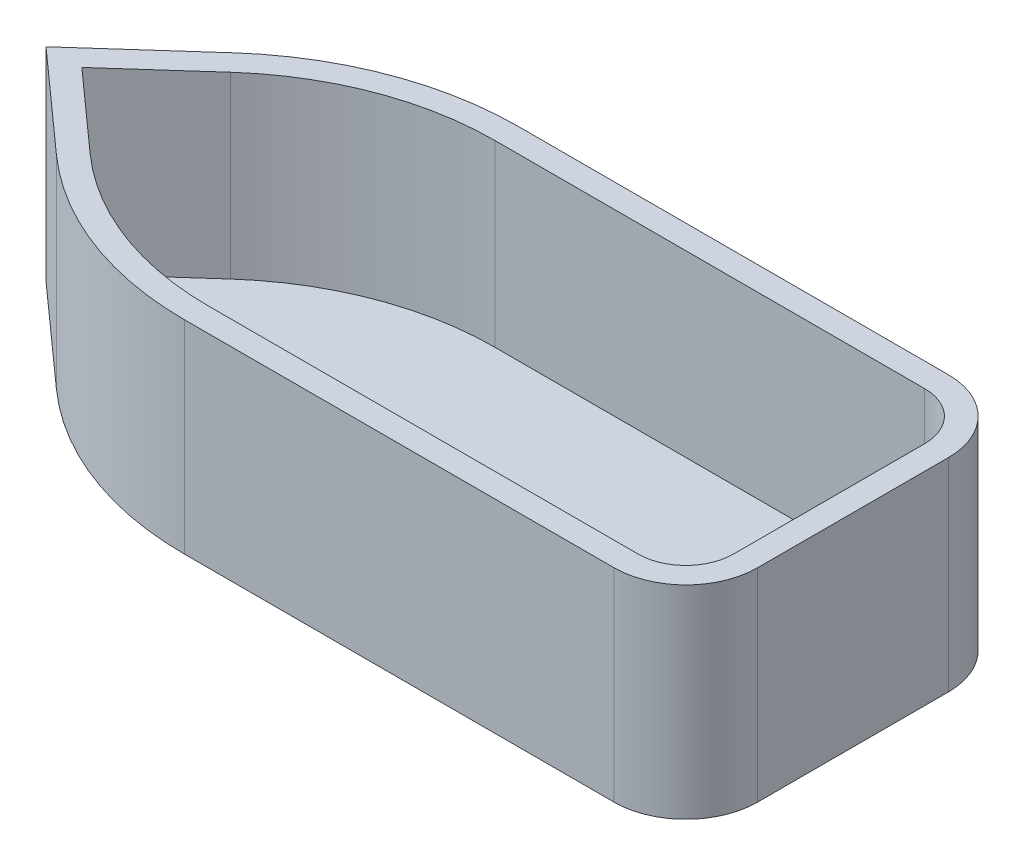
ISO-10303-21;
HEADER;
FILE_DESCRIPTION(('STEP AP214'),'2;1');
FILE_NAME('part.step','',(''),(''),'','','');
FILE_SCHEMA(('AUTOMOTIVE_DESIGN { 1 0 10303 214 1 1 1 1 }'));
ENDSEC;
DATA;
#1=APPLICATION_CONTEXT('core data for automotive mechanical design processes');
#2=APPLICATION_PROTOCOL_DEFINITION('international standard','automotive_design',2000,#1);
#3=PRODUCT_CONTEXT('',#1,'mechanical');
#4=PRODUCT('Part','Part','',(#3));
#5=PRODUCT_RELATED_PRODUCT_CATEGORY('part','',(#4));
#6=PRODUCT_DEFINITION_FORMATION('','',#4);
#7=PRODUCT_DEFINITION_CONTEXT('part definition',#1,'design');
#8=PRODUCT_DEFINITION('design','',#6,#7);
#9=PRODUCT_DEFINITION_SHAPE('','',#8);
#10=(LENGTH_UNIT() NAMED_UNIT(*) SI_UNIT(.MILLI.,.METRE.));
#11=(NAMED_UNIT(*) PLANE_ANGLE_UNIT() SI_UNIT($,.RADIAN.));
#12=(NAMED_UNIT(*) SI_UNIT($,.STERADIAN.) SOLID_ANGLE_UNIT());
#13=UNCERTAINTY_MEASURE_WITH_UNIT(LENGTH_MEASURE(1.E-05),#10,'distance_accuracy_value','');
#14=(GEOMETRIC_REPRESENTATION_CONTEXT(3) GLOBAL_UNCERTAINTY_ASSIGNED_CONTEXT((#13)) GLOBAL_UNIT_ASSIGNED_CONTEXT((#10,
#11,#12)) REPRESENTATION_CONTEXT('',''));
#15=CARTESIAN_POINT('',(0.,0.,0.));
#16=DIRECTION('',(0.,0.,1.));
#17=DIRECTION('',(1.,0.,0.));
#18=AXIS2_PLACEMENT_3D('',#15,#16,#17);
#19=CARTESIAN_POINT('',(-57.8038067349927,75.,-40.));
#20=DIRECTION('',(0.,-1.,0.));
#21=DIRECTION('',(0.,0.,-1.));
#22=AXIS2_PLACEMENT_3D('',#19,#20,#21);
#23=PLANE('',#22);
#24=CARTESIAN_POINT('',(-57.8038067349927,75.,-40.));
#25=DIRECTION('',(0.,-1.,0.));
#26=DIRECTION('',(0.,0.,-1.));
#27=AXIS2_PLACEMENT_3D('',#24,#25,#26);
#28=CIRCLE('',#27,30.);
#29=CARTESIAN_POINT('',(-27.8038067349927,75.,-40.));
#30=VERTEX_POINT('',#29);
#31=CARTESIAN_POINT('',(-57.8038067349927,75.,-70.));
#32=VERTEX_POINT('',#31);
#33=EDGE_CURVE('E333',#30,#32,#28,.F.);
#34=ORIENTED_EDGE('',*,*,#33,.T.);
#35=DIRECTION('',(-1.,0.,0.));
#36=VECTOR('',#35,1.);
#37=CARTESIAN_POINT('',(-57.8038067349927,75.,-70.));
#38=LINE('',#37,#36);
#39=CARTESIAN_POINT('',(-237.803806734993,75.,-70.));
#40=VERTEX_POINT('',#39);
#41=EDGE_CURVE('E336',#32,#40,#38,.T.);
#42=ORIENTED_EDGE('',*,*,#41,.T.);
#43=CARTESIAN_POINT('',(-237.803806734993,75.,60.));
#44=DIRECTION('',(0.,-1.,0.));
#45=DIRECTION('',(0.,0.,-1.));
#46=AXIS2_PLACEMENT_3D('',#43,#44,#45);
#47=CIRCLE('',#46,130.);
#48=CARTESIAN_POINT('',(-324.470473401659,75.,-36.8962790249908));
#49=VERTEX_POINT('',#48);
#50=EDGE_CURVE('E339',#40,#49,#47,.F.);
#51=ORIENTED_EDGE('',*,*,#50,.T.);
#52=DIRECTION('',(-0.745355992499929,0.,0.666666666666668));
#53=VECTOR('',#52,1.);
#54=CARTESIAN_POINT('',(-174.780073901664,75.,-170.783442569427));
#55=LINE('',#54,#53);
#56=CARTESIAN_POINT('',(-365.721767409999,75.,0.));
#57=VERTEX_POINT('',#56);
#58=EDGE_CURVE('E342',#49,#57,#55,.T.);
#59=ORIENTED_EDGE('',*,*,#58,.T.);
#60=DIRECTION('',(0.745355992499929,0.,0.666666666666667));
#61=VECTOR('',#60,1.);
#62=CARTESIAN_POINT('',(-214.53239350166,75.,135.227887013871));
#63=LINE('',#62,#61);
#64=CARTESIAN_POINT('',(-324.470473401659,75.,36.8962790249909));
#65=VERTEX_POINT('',#64);
#66=EDGE_CURVE('E345',#57,#65,#63,.T.);
#67=ORIENTED_EDGE('',*,*,#66,.T.);
#68=CARTESIAN_POINT('',(-237.803806734993,75.,-60.));
#69=DIRECTION('',(0.,-1.,0.));
#70=DIRECTION('',(0.,0.,-1.));
#71=AXIS2_PLACEMENT_3D('',#68,#69,#70);
#72=CIRCLE('',#71,130.);
#73=CARTESIAN_POINT('',(-237.803806734993,75.,70.));
#74=VERTEX_POINT('',#73);
#75=EDGE_CURVE('E348',#65,#74,#72,.F.);
#76=ORIENTED_EDGE('',*,*,#75,.T.);
#77=DIRECTION('',(1.,0.,0.));
#78=VECTOR('',#77,1.);
#79=CARTESIAN_POINT('',(-57.8038067349926,75.,70.));
#80=LINE('',#79,#78);
#81=CARTESIAN_POINT('',(-57.8038067349927,75.,70.));
#82=VERTEX_POINT('',#81);
#83=EDGE_CURVE('E351',#74,#82,#80,.T.);
#84=ORIENTED_EDGE('',*,*,#83,.T.);
#85=CARTESIAN_POINT('',(-57.8038067349927,75.,40.));
#86=DIRECTION('',(0.,-1.,0.));
#87=DIRECTION('',(0.,0.,-1.));
#88=AXIS2_PLACEMENT_3D('',#85,#86,#87);
#89=CIRCLE('',#88,30.);
#90=CARTESIAN_POINT('',(-27.8038067349927,75.,40.));
#91=VERTEX_POINT('',#90);
#92=EDGE_CURVE('E353',#82,#91,#89,.F.);
#93=ORIENTED_EDGE('',*,*,#92,.T.);
#94=DIRECTION('',(0.,0.,-1.));
#95=VECTOR('',#94,1.);
#96=CARTESIAN_POINT('',(-27.8038067349927,75.,-40.));
#97=LINE('',#96,#95);
#98=EDGE_CURVE('E48',#91,#30,#97,.T.);
#99=ORIENTED_EDGE('',*,*,#98,.T.);
#100=EDGE_LOOP('',(#34,#42,#51,#59,#67,#76,#84,#93,#99));
#101=FACE_BOUND('',#100,.T.);
#102=CARTESIAN_POINT('',(-57.8038067349927,75.,-40.));
#103=DIRECTION('',(0.,1.,0.));
#104=DIRECTION('',(0.,0.,-1.));
#105=AXIS2_PLACEMENT_3D('',#102,#103,#104);
#106=CIRCLE('',#105,20.);
#107=CARTESIAN_POINT('',(-37.8038067349927,75.,-40.));
#108=VERTEX_POINT('',#107);
#109=CARTESIAN_POINT('',(-57.8038067349927,75.,-60.));
#110=VERTEX_POINT('',#109);
#111=EDGE_CURVE('E174',#108,#110,#106,.T.);
#112=ORIENTED_EDGE('',*,*,#111,.F.);
#113=DIRECTION('',(0.,0.,-1.));
#114=VECTOR('',#113,1.);
#115=CARTESIAN_POINT('',(-37.8038067349927,75.,40.));
#116=LINE('',#115,#114);
#117=CARTESIAN_POINT('',(-37.8038067349927,75.,40.));
#118=VERTEX_POINT('',#117);
#119=EDGE_CURVE('E221',#118,#108,#116,.T.);
#120=ORIENTED_EDGE('',*,*,#119,.F.);
#121=CARTESIAN_POINT('',(-57.8038067349927,75.,40.));
#122=DIRECTION('',(0.,1.,0.));
#123=DIRECTION('',(0.,0.,1.));
#124=AXIS2_PLACEMENT_3D('',#121,#122,#123);
#125=CIRCLE('',#124,20.);
#126=CARTESIAN_POINT('',(-57.8038067349927,75.,60.));
#127=VERTEX_POINT('',#126);
#128=EDGE_CURVE('E218',#127,#118,#125,.T.);
#129=ORIENTED_EDGE('',*,*,#128,.F.);
#130=DIRECTION('',(1.,0.,0.));
#131=VECTOR('',#130,1.);
#132=CARTESIAN_POINT('',(-237.803806734993,75.,60.));
#133=LINE('',#132,#131);
#134=CARTESIAN_POINT('',(-237.803806734993,75.,60.));
#135=VERTEX_POINT('',#134);
#136=EDGE_CURVE('E215',#135,#127,#133,.T.);
#137=ORIENTED_EDGE('',*,*,#136,.F.);
#138=CARTESIAN_POINT('',(-237.803806734993,75.,-60.));
#139=DIRECTION('',(0.,1.,0.));
#140=DIRECTION('',(0.,0.,-1.));
#141=AXIS2_PLACEMENT_3D('',#138,#139,#140);
#142=CIRCLE('',#141,120.);
#143=CARTESIAN_POINT('',(-317.803806734993,75.,29.4427190999916));
#144=VERTEX_POINT('',#143);
#145=EDGE_CURVE('E212',#144,#135,#142,.T.);
#146=ORIENTED_EDGE('',*,*,#145,.F.);
#147=DIRECTION('',(0.745355992499929,0.,0.666666666666667));
#148=VECTOR('',#147,1.);
#149=CARTESIAN_POINT('',(-317.803806734993,75.,29.4427190999916));
#150=LINE('',#149,#148);
#151=CARTESIAN_POINT('',(-350.721767409999,75.,0.));
#152=VERTEX_POINT('',#151);
#153=EDGE_CURVE('E209',#152,#144,#150,.T.);
#154=ORIENTED_EDGE('',*,*,#153,.F.);
#155=DIRECTION('',(-0.745355992499929,0.,0.666666666666668));
#156=VECTOR('',#155,1.);
#157=CARTESIAN_POINT('',(-317.803806734993,75.,-29.4427190999916));
#158=LINE('',#157,#156);
#159=CARTESIAN_POINT('',(-317.803806734993,75.,-29.4427190999916));
#160=VERTEX_POINT('',#159);
#161=EDGE_CURVE('E204',#160,#152,#158,.T.);
#162=ORIENTED_EDGE('',*,*,#161,.F.);
#163=CARTESIAN_POINT('',(-237.803806734993,75.,60.));
#164=DIRECTION('',(0.,1.,0.));
#165=DIRECTION('',(0.,0.,-1.));
#166=AXIS2_PLACEMENT_3D('',#163,#164,#165);
#167=CIRCLE('',#166,120.);
#168=CARTESIAN_POINT('',(-237.803806734993,75.,-60.));
#169=VERTEX_POINT('',#168);
#170=EDGE_CURVE('E200',#169,#160,#167,.T.);
#171=ORIENTED_EDGE('',*,*,#170,.F.);
#172=DIRECTION('',(-1.,0.,0.));
#173=VECTOR('',#172,1.);
#174=CARTESIAN_POINT('',(-237.803806734993,75.,-60.));
#175=LINE('',#174,#173);
#176=EDGE_CURVE('E186',#110,#169,#175,.T.);
#177=ORIENTED_EDGE('',*,*,#176,.F.);
#178=EDGE_LOOP('',(#112,#120,#129,#137,#146,#154,#162,#171,#177));
#179=FACE_BOUND('',#178,.T.);
#180=ADVANCED_FACE('F44',(#101,#179),#23,.F.);
#181=CARTESIAN_POINT('',(-57.8038067349927,75.,-40.));
#182=DIRECTION('',(0.,-1.,0.));
#183=DIRECTION('',(0.,0.,-1.));
#184=AXIS2_PLACEMENT_3D('',#181,#182,#183);
#185=CYLINDRICAL_SURFACE('',#184,30.);
#186=CARTESIAN_POINT('',(-57.8038067349927,-9.99999999999999,-40.));
#187=DIRECTION('',(0.,-1.,0.));
#188=DIRECTION('',(0.,0.,-1.));
#189=AXIS2_PLACEMENT_3D('',#186,#187,#188);
#190=CIRCLE('',#189,30.);
#191=CARTESIAN_POINT('',(-27.8038067349927,-9.99999999999999,-40.));
#192=VERTEX_POINT('',#191);
#193=CARTESIAN_POINT('',(-57.8038067349927,-9.99999999999999,-70.));
#194=VERTEX_POINT('',#193);
#195=EDGE_CURVE('E195',#192,#194,#190,.F.);
#196=ORIENTED_EDGE('',*,*,#195,.T.);
#197=DIRECTION('',(0.,1.,0.));
#198=VECTOR('',#197,1.);
#199=CARTESIAN_POINT('',(-57.8038067349927,75.,-70.));
#200=LINE('',#199,#198);
#201=EDGE_CURVE('E11',#32,#194,#200,.F.);
#202=ORIENTED_EDGE('',*,*,#201,.F.);
#203=ORIENTED_EDGE('',*,*,#33,.F.);
#204=DIRECTION('',(0.,-1.,0.));
#205=VECTOR('',#204,1.);
#206=CARTESIAN_POINT('',(-27.8038067349927,75.,-40.));
#207=LINE('',#206,#205);
#208=EDGE_CURVE('E279',#30,#192,#207,.T.);
#209=ORIENTED_EDGE('',*,*,#208,.T.);
#210=EDGE_LOOP('',(#196,#202,#203,#209));
#211=FACE_BOUND('',#210,.T.);
#212=ADVANCED_FACE('F370',(#211),#185,.T.);
#213=CARTESIAN_POINT('',(-237.803806734993,75.,-70.));
#214=DIRECTION('',(0.,0.,1.));
#215=DIRECTION('',(1.,0.,0.));
#216=AXIS2_PLACEMENT_3D('',#213,#214,#215);
#217=PLANE('',#216);
#218=DIRECTION('',(-1.,0.,0.));
#219=VECTOR('',#218,1.);
#220=CARTESIAN_POINT('',(-57.8038067349927,-10.,-70.));
#221=LINE('',#220,#219);
#222=CARTESIAN_POINT('',(-237.803806734993,-9.99999999999999,-70.));
#223=VERTEX_POINT('',#222);
#224=EDGE_CURVE('E277',#194,#223,#221,.T.);
#225=ORIENTED_EDGE('',*,*,#224,.T.);
#226=DIRECTION('',(0.,-1.,0.));
#227=VECTOR('',#226,1.);
#228=CARTESIAN_POINT('',(-237.803806734993,75.,-70.));
#229=LINE('',#228,#227);
#230=EDGE_CURVE('E54',#40,#223,#229,.T.);
#231=ORIENTED_EDGE('',*,*,#230,.F.);
#232=ORIENTED_EDGE('',*,*,#41,.F.);
#233=ORIENTED_EDGE('',*,*,#201,.T.);
#234=EDGE_LOOP('',(#225,#231,#232,#233));
#235=FACE_BOUND('',#234,.T.);
#236=ADVANCED_FACE('F375',(#235),#217,.F.);
#237=CARTESIAN_POINT('',(-237.803806734993,75.,60.));
#238=DIRECTION('',(0.,-1.,0.));
#239=DIRECTION('',(0.,0.,-1.));
#240=AXIS2_PLACEMENT_3D('',#237,#238,#239);
#241=CYLINDRICAL_SURFACE('',#240,130.);
#242=CARTESIAN_POINT('',(-237.803806734993,-9.99999999999999,60.));
#243=DIRECTION('',(0.,-1.,0.));
#244=DIRECTION('',(0.,0.,-1.));
#245=AXIS2_PLACEMENT_3D('',#242,#243,#244);
#246=CIRCLE('',#245,130.);
#247=CARTESIAN_POINT('',(-324.470473401659,-9.99999999999999,-36.8962790249909));
#248=VERTEX_POINT('',#247);
#249=EDGE_CURVE('E286',#223,#248,#246,.F.);
#250=ORIENTED_EDGE('',*,*,#249,.T.);
#251=DIRECTION('',(0.,1.,0.));
#252=VECTOR('',#251,1.);
#253=CARTESIAN_POINT('',(-324.470473401659,75.,-36.8962790249909));
#254=LINE('',#253,#252);
#255=EDGE_CURVE('E290',#49,#248,#254,.F.);
#256=ORIENTED_EDGE('',*,*,#255,.F.);
#257=ORIENTED_EDGE('',*,*,#50,.F.);
#258=ORIENTED_EDGE('',*,*,#230,.T.);
#259=EDGE_LOOP('',(#250,#256,#257,#258));
#260=FACE_BOUND('',#259,.T.);
#261=ADVANCED_FACE('F378',(#260),#241,.T.);
#262=CARTESIAN_POINT('',(-324.470473401659,75.,-36.8962790249909));
#263=DIRECTION('',(0.666666666666668,0.,0.745355992499929));
#264=DIRECTION('',(0.745355992499929,0.,-0.666666666666668));
#265=AXIS2_PLACEMENT_3D('',#262,#263,#264);
#266=PLANE('',#265);
#267=DIRECTION('',(-0.745355992499929,0.,0.666666666666668));
#268=VECTOR('',#267,1.);
#269=CARTESIAN_POINT('',(-174.780073901664,-10.,-170.783442569427));
#270=LINE('',#269,#268);
#271=CARTESIAN_POINT('',(-365.721767409999,-10.,0.));
#272=VERTEX_POINT('',#271);
#273=EDGE_CURVE('E293',#248,#272,#270,.T.);
#274=ORIENTED_EDGE('',*,*,#273,.T.);
#275=DIRECTION('',(0.,-1.,0.));
#276=VECTOR('',#275,1.);
#277=CARTESIAN_POINT('',(-365.721767409999,75.,0.));
#278=LINE('',#277,#276);
#279=EDGE_CURVE('E297',#57,#272,#278,.T.);
#280=ORIENTED_EDGE('',*,*,#279,.F.);
#281=ORIENTED_EDGE('',*,*,#58,.F.);
#282=ORIENTED_EDGE('',*,*,#255,.T.);
#283=EDGE_LOOP('',(#274,#280,#281,#282));
#284=FACE_BOUND('',#283,.T.);
#285=ADVANCED_FACE('F383',(#284),#266,.F.);
#286=CARTESIAN_POINT('',(-324.470473401659,75.,36.8962790249909));
#287=DIRECTION('',(0.666666666666667,0.,-0.745355992499929));
#288=DIRECTION('',(-0.745355992499929,0.,-0.666666666666667));
#289=AXIS2_PLACEMENT_3D('',#286,#287,#288);
#290=PLANE('',#289);
#291=DIRECTION('',(0.745355992499929,0.,0.666666666666667));
#292=VECTOR('',#291,1.);
#293=CARTESIAN_POINT('',(-214.53239350166,-10.,135.227887013871));
#294=LINE('',#293,#292);
#295=CARTESIAN_POINT('',(-324.470473401659,-9.99999999999999,36.8962790249909));
#296=VERTEX_POINT('',#295);
#297=EDGE_CURVE('E300',#272,#296,#294,.T.);
#298=ORIENTED_EDGE('',*,*,#297,.T.);
#299=DIRECTION('',(0.,-1.,0.));
#300=VECTOR('',#299,1.);
#301=CARTESIAN_POINT('',(-324.470473401659,75.,36.8962790249909));
#302=LINE('',#301,#300);
#303=EDGE_CURVE('E304',#65,#296,#302,.T.);
#304=ORIENTED_EDGE('',*,*,#303,.F.);
#305=ORIENTED_EDGE('',*,*,#66,.F.);
#306=ORIENTED_EDGE('',*,*,#279,.T.);
#307=EDGE_LOOP('',(#298,#304,#305,#306));
#308=FACE_BOUND('',#307,.T.);
#309=ADVANCED_FACE('F389',(#308),#290,.F.);
#310=CARTESIAN_POINT('',(-237.803806734993,75.,-60.));
#311=DIRECTION('',(0.,-1.,0.));
#312=DIRECTION('',(0.,0.,-1.));
#313=AXIS2_PLACEMENT_3D('',#310,#311,#312);
#314=CYLINDRICAL_SURFACE('',#313,130.);
#315=CARTESIAN_POINT('',(-237.803806734993,-9.99999999999999,-60.));
#316=DIRECTION('',(0.,-1.,0.));
#317=DIRECTION('',(0.,0.,-1.));
#318=AXIS2_PLACEMENT_3D('',#315,#316,#317);
#319=CIRCLE('',#318,130.);
#320=CARTESIAN_POINT('',(-237.803806734993,-9.99999999999999,70.));
#321=VERTEX_POINT('',#320);
#322=EDGE_CURVE('E307',#296,#321,#319,.F.);
#323=ORIENTED_EDGE('',*,*,#322,.T.);
#324=DIRECTION('',(0.,1.,0.));
#325=VECTOR('',#324,1.);
#326=CARTESIAN_POINT('',(-237.803806734993,75.,70.));
#327=LINE('',#326,#325);
#328=EDGE_CURVE('E311',#74,#321,#327,.F.);
#329=ORIENTED_EDGE('',*,*,#328,.F.);
#330=ORIENTED_EDGE('',*,*,#75,.F.);
#331=ORIENTED_EDGE('',*,*,#303,.T.);
#332=EDGE_LOOP('',(#323,#329,#330,#331));
#333=FACE_BOUND('',#332,.T.);
#334=ADVANCED_FACE('F393',(#333),#314,.T.);
#335=CARTESIAN_POINT('',(-237.803806734993,75.,70.));
#336=DIRECTION('',(0.,0.,-1.));
#337=DIRECTION('',(-1.,0.,0.));
#338=AXIS2_PLACEMENT_3D('',#335,#336,#337);
#339=PLANE('',#338);
#340=DIRECTION('',(1.,0.,0.));
#341=VECTOR('',#340,1.);
#342=CARTESIAN_POINT('',(-57.8038067349926,-10.,70.));
#343=LINE('',#342,#341);
#344=CARTESIAN_POINT('',(-57.8038067349927,-9.99999999999999,70.));
#345=VERTEX_POINT('',#344);
#346=EDGE_CURVE('E314',#321,#345,#343,.T.);
#347=ORIENTED_EDGE('',*,*,#346,.T.);
#348=DIRECTION('',(0.,-1.,0.));
#349=VECTOR('',#348,1.);
#350=CARTESIAN_POINT('',(-57.8038067349927,75.,70.));
#351=LINE('',#350,#349);
#352=EDGE_CURVE('E318',#82,#345,#351,.T.);
#353=ORIENTED_EDGE('',*,*,#352,.F.);
#354=ORIENTED_EDGE('',*,*,#83,.F.);
#355=ORIENTED_EDGE('',*,*,#328,.T.);
#356=EDGE_LOOP('',(#347,#353,#354,#355));
#357=FACE_BOUND('',#356,.T.);
#358=ADVANCED_FACE('F396',(#357),#339,.F.);
#359=CARTESIAN_POINT('',(-57.8038067349927,75.,40.));
#360=DIRECTION('',(0.,-1.,0.));
#361=DIRECTION('',(0.,0.,-1.));
#362=AXIS2_PLACEMENT_3D('',#359,#360,#361);
#363=CYLINDRICAL_SURFACE('',#362,30.);
#364=CARTESIAN_POINT('',(-57.8038067349927,-9.99999999999999,40.));
#365=DIRECTION('',(0.,-1.,0.));
#366=DIRECTION('',(0.,0.,-1.));
#367=AXIS2_PLACEMENT_3D('',#364,#365,#366);
#368=CIRCLE('',#367,30.);
#369=CARTESIAN_POINT('',(-27.8038067349927,-9.99999999999999,40.));
#370=VERTEX_POINT('',#369);
#371=EDGE_CURVE('E321',#345,#370,#368,.F.);
#372=ORIENTED_EDGE('',*,*,#371,.T.);
#373=DIRECTION('',(0.,1.,0.));
#374=VECTOR('',#373,1.);
#375=CARTESIAN_POINT('',(-27.8038067349927,75.,40.));
#376=LINE('',#375,#374);
#377=EDGE_CURVE('E283',#91,#370,#376,.F.);
#378=ORIENTED_EDGE('',*,*,#377,.F.);
#379=ORIENTED_EDGE('',*,*,#92,.F.);
#380=ORIENTED_EDGE('',*,*,#352,.T.);
#381=EDGE_LOOP('',(#372,#378,#379,#380));
#382=FACE_BOUND('',#381,.T.);
#383=ADVANCED_FACE('F361',(#382),#363,.T.);
#384=CARTESIAN_POINT('',(-27.8038067349927,75.,40.));
#385=DIRECTION('',(-1.,0.,0.));
#386=DIRECTION('',(0.,0.,1.));
#387=AXIS2_PLACEMENT_3D('',#384,#385,#386);
#388=PLANE('',#387);
#389=DIRECTION('',(0.,0.,-1.));
#390=VECTOR('',#389,1.);
#391=CARTESIAN_POINT('',(-27.8038067349927,-10.,-40.));
#392=LINE('',#391,#390);
#393=EDGE_CURVE('E327',#370,#192,#392,.T.);
#394=ORIENTED_EDGE('',*,*,#393,.T.);
#395=ORIENTED_EDGE('',*,*,#208,.F.);
#396=ORIENTED_EDGE('',*,*,#98,.F.);
#397=ORIENTED_EDGE('',*,*,#377,.T.);
#398=EDGE_LOOP('',(#394,#395,#396,#397));
#399=FACE_BOUND('',#398,.T.);
#400=ADVANCED_FACE('F365',(#399),#388,.F.);
#401=CARTESIAN_POINT('',(-57.8038067349927,-10.,-40.));
#402=DIRECTION('',(0.,-1.,0.));
#403=DIRECTION('',(0.,0.,-1.));
#404=AXIS2_PLACEMENT_3D('',#401,#402,#403);
#405=PLANE('',#404);
#406=ORIENTED_EDGE('',*,*,#195,.F.);
#407=ORIENTED_EDGE('',*,*,#393,.F.);
#408=ORIENTED_EDGE('',*,*,#371,.F.);
#409=ORIENTED_EDGE('',*,*,#346,.F.);
#410=ORIENTED_EDGE('',*,*,#322,.F.);
#411=ORIENTED_EDGE('',*,*,#297,.F.);
#412=ORIENTED_EDGE('',*,*,#273,.F.);
#413=ORIENTED_EDGE('',*,*,#249,.F.);
#414=ORIENTED_EDGE('',*,*,#224,.F.);
#415=EDGE_LOOP('',(#406,#407,#408,#409,#410,#411,#412,#413,#414));
#416=FACE_BOUND('',#415,.T.);
#417=ADVANCED_FACE('F46',(#416),#405,.T.);
#418=CARTESIAN_POINT('',(-57.8038067349927,75.,-40.));
#419=DIRECTION('',(0.,-1.,0.));
#420=DIRECTION('',(0.,0.,-1.));
#421=AXIS2_PLACEMENT_3D('',#418,#419,#420);
#422=CYLINDRICAL_SURFACE('',#421,20.);
#423=CARTESIAN_POINT('',(-57.8038067349927,0.,-40.));
#424=DIRECTION('',(0.,1.,0.));
#425=DIRECTION('',(0.,0.,-1.));
#426=AXIS2_PLACEMENT_3D('',#423,#424,#425);
#427=CIRCLE('',#426,20.);
#428=CARTESIAN_POINT('',(-37.8038067349927,0.,-40.));
#429=VERTEX_POINT('',#428);
#430=CARTESIAN_POINT('',(-57.8038067349927,0.,-60.));
#431=VERTEX_POINT('',#430);
#432=EDGE_CURVE('E224',#429,#431,#427,.T.);
#433=ORIENTED_EDGE('',*,*,#432,.F.);
#434=DIRECTION('',(0.,-1.,0.));
#435=VECTOR('',#434,1.);
#436=CARTESIAN_POINT('',(-37.8038067349927,75.,-40.));
#437=LINE('',#436,#435);
#438=EDGE_CURVE('E181',#108,#429,#437,.T.);
#439=ORIENTED_EDGE('',*,*,#438,.F.);
#440=ORIENTED_EDGE('',*,*,#111,.T.);
#441=DIRECTION('',(0.,-1.,0.));
#442=VECTOR('',#441,1.);
#443=CARTESIAN_POINT('',(-57.8038067349927,75.,-60.));
#444=LINE('',#443,#442);
#445=EDGE_CURVE('E178',#110,#431,#444,.T.);
#446=ORIENTED_EDGE('',*,*,#445,.T.);
#447=EDGE_LOOP('',(#433,#439,#440,#446));
#448=FACE_BOUND('',#447,.T.);
#449=ADVANCED_FACE('F177',(#448),#422,.F.);
#450=CARTESIAN_POINT('',(-237.803806734993,75.,-60.));
#451=DIRECTION('',(0.,0.,1.));
#452=DIRECTION('',(1.,0.,0.));
#453=AXIS2_PLACEMENT_3D('',#450,#451,#452);
#454=PLANE('',#453);
#455=DIRECTION('',(-1.,0.,0.));
#456=VECTOR('',#455,1.);
#457=CARTESIAN_POINT('',(-237.803806734993,0.,-60.));
#458=LINE('',#457,#456);
#459=CARTESIAN_POINT('',(-237.803806734993,0.,-60.));
#460=VERTEX_POINT('',#459);
#461=EDGE_CURVE('E193',#431,#460,#458,.T.);
#462=ORIENTED_EDGE('',*,*,#461,.F.);
#463=ORIENTED_EDGE('',*,*,#445,.F.);
#464=ORIENTED_EDGE('',*,*,#176,.T.);
#465=DIRECTION('',(0.,-1.,0.));
#466=VECTOR('',#465,1.);
#467=CARTESIAN_POINT('',(-237.803806734993,75.,-60.));
#468=LINE('',#467,#466);
#469=EDGE_CURVE('E196',#169,#460,#468,.T.);
#470=ORIENTED_EDGE('',*,*,#469,.T.);
#471=EDGE_LOOP('',(#462,#463,#464,#470));
#472=FACE_BOUND('',#471,.T.);
#473=ADVANCED_FACE('F190',(#472),#454,.T.);
#474=CARTESIAN_POINT('',(-237.803806734993,75.,60.));
#475=DIRECTION('',(0.,-1.,0.));
#476=DIRECTION('',(0.,0.,-1.));
#477=AXIS2_PLACEMENT_3D('',#474,#475,#476);
#478=CYLINDRICAL_SURFACE('',#477,120.);
#479=CARTESIAN_POINT('',(-237.803806734993,0.,60.));
#480=DIRECTION('',(0.,1.,0.));
#481=DIRECTION('',(0.,0.,-1.));
#482=AXIS2_PLACEMENT_3D('',#479,#480,#481);
#483=CIRCLE('',#482,120.);
#484=CARTESIAN_POINT('',(-317.803806734993,0.,-29.4427190999916));
#485=VERTEX_POINT('',#484);
#486=EDGE_CURVE('E229',#460,#485,#483,.T.);
#487=ORIENTED_EDGE('',*,*,#486,.F.);
#488=ORIENTED_EDGE('',*,*,#469,.F.);
#489=ORIENTED_EDGE('',*,*,#170,.T.);
#490=DIRECTION('',(0.,-1.,0.));
#491=VECTOR('',#490,1.);
#492=CARTESIAN_POINT('',(-317.803806734993,75.,-29.4427190999916));
#493=LINE('',#492,#491);
#494=EDGE_CURVE('E269',#160,#485,#493,.T.);
#495=ORIENTED_EDGE('',*,*,#494,.T.);
#496=EDGE_LOOP('',(#487,#488,#489,#495));
#497=FACE_BOUND('',#496,.T.);
#498=ADVANCED_FACE('F456',(#497),#478,.F.);
#499=CARTESIAN_POINT('',(-317.803806734993,75.,-29.4427190999916));
#500=DIRECTION('',(0.666666666666668,0.,0.745355992499929));
#501=DIRECTION('',(0.745355992499929,0.,-0.666666666666668));
#502=AXIS2_PLACEMENT_3D('',#499,#500,#501);
#503=PLANE('',#502);
#504=DIRECTION('',(-0.745355992499929,0.,0.666666666666668));
#505=VECTOR('',#504,1.);
#506=CARTESIAN_POINT('',(-317.803806734993,0.,-29.4427190999916));
#507=LINE('',#506,#505);
#508=CARTESIAN_POINT('',(-350.721767409999,0.,0.));
#509=VERTEX_POINT('',#508);
#510=EDGE_CURVE('E232',#485,#509,#507,.T.);
#511=ORIENTED_EDGE('',*,*,#510,.F.);
#512=ORIENTED_EDGE('',*,*,#494,.F.);
#513=ORIENTED_EDGE('',*,*,#161,.T.);
#514=DIRECTION('',(0.,-1.,0.));
#515=VECTOR('',#514,1.);
#516=CARTESIAN_POINT('',(-350.721767409999,75.,0.));
#517=LINE('',#516,#515);
#518=EDGE_CURVE('E265',#152,#509,#517,.T.);
#519=ORIENTED_EDGE('',*,*,#518,.T.);
#520=EDGE_LOOP('',(#511,#512,#513,#519));
#521=FACE_BOUND('',#520,.T.);
#522=ADVANCED_FACE('F466',(#521),#503,.T.);
#523=CARTESIAN_POINT('',(-317.803806734993,75.,29.4427190999916));
#524=DIRECTION('',(0.666666666666667,0.,-0.745355992499929));
#525=DIRECTION('',(-0.745355992499929,0.,-0.666666666666667));
#526=AXIS2_PLACEMENT_3D('',#523,#524,#525);
#527=PLANE('',#526);
#528=DIRECTION('',(0.745355992499929,0.,0.666666666666667));
#529=VECTOR('',#528,1.);
#530=CARTESIAN_POINT('',(-317.803806734993,0.,29.4427190999916));
#531=LINE('',#530,#529);
#532=CARTESIAN_POINT('',(-317.803806734993,0.,29.4427190999916));
#533=VERTEX_POINT('',#532);
#534=EDGE_CURVE('E235',#509,#533,#531,.T.);
#535=ORIENTED_EDGE('',*,*,#534,.F.);
#536=ORIENTED_EDGE('',*,*,#518,.F.);
#537=ORIENTED_EDGE('',*,*,#153,.T.);
#538=DIRECTION('',(0.,-1.,0.));
#539=VECTOR('',#538,1.);
#540=CARTESIAN_POINT('',(-317.803806734993,75.,29.4427190999916));
#541=LINE('',#540,#539);
#542=EDGE_CURVE('E261',#144,#533,#541,.T.);
#543=ORIENTED_EDGE('',*,*,#542,.T.);
#544=EDGE_LOOP('',(#535,#536,#537,#543));
#545=FACE_BOUND('',#544,.T.);
#546=ADVANCED_FACE('F477',(#545),#527,.T.);
#547=CARTESIAN_POINT('',(-237.803806734993,75.,-60.));
#548=DIRECTION('',(0.,-1.,0.));
#549=DIRECTION('',(0.,0.,-1.));
#550=AXIS2_PLACEMENT_3D('',#547,#548,#549);
#551=CYLINDRICAL_SURFACE('',#550,120.);
#552=CARTESIAN_POINT('',(-237.803806734993,0.,-60.));
#553=DIRECTION('',(0.,1.,0.));
#554=DIRECTION('',(0.,0.,-1.));
#555=AXIS2_PLACEMENT_3D('',#552,#553,#554);
#556=CIRCLE('',#555,120.);
#557=CARTESIAN_POINT('',(-237.803806734993,0.,60.));
#558=VERTEX_POINT('',#557);
#559=EDGE_CURVE('E238',#533,#558,#556,.T.);
#560=ORIENTED_EDGE('',*,*,#559,.F.);
#561=ORIENTED_EDGE('',*,*,#542,.F.);
#562=ORIENTED_EDGE('',*,*,#145,.T.);
#563=DIRECTION('',(0.,-1.,0.));
#564=VECTOR('',#563,1.);
#565=CARTESIAN_POINT('',(-237.803806734993,75.,60.));
#566=LINE('',#565,#564);
#567=EDGE_CURVE('E257',#135,#558,#566,.T.);
#568=ORIENTED_EDGE('',*,*,#567,.T.);
#569=EDGE_LOOP('',(#560,#561,#562,#568));
#570=FACE_BOUND('',#569,.T.);
#571=ADVANCED_FACE('F488',(#570),#551,.F.);
#572=CARTESIAN_POINT('',(-237.803806734993,75.,60.));
#573=DIRECTION('',(0.,0.,-1.));
#574=DIRECTION('',(-1.,0.,0.));
#575=AXIS2_PLACEMENT_3D('',#572,#573,#574);
#576=PLANE('',#575);
#577=DIRECTION('',(1.,0.,0.));
#578=VECTOR('',#577,1.);
#579=CARTESIAN_POINT('',(-237.803806734993,0.,60.));
#580=LINE('',#579,#578);
#581=CARTESIAN_POINT('',(-57.8038067349927,0.,60.));
#582=VERTEX_POINT('',#581);
#583=EDGE_CURVE('E241',#558,#582,#580,.T.);
#584=ORIENTED_EDGE('',*,*,#583,.F.);
#585=ORIENTED_EDGE('',*,*,#567,.F.);
#586=ORIENTED_EDGE('',*,*,#136,.T.);
#587=DIRECTION('',(0.,-1.,0.));
#588=VECTOR('',#587,1.);
#589=CARTESIAN_POINT('',(-57.8038067349927,75.,60.));
#590=LINE('',#589,#588);
#591=EDGE_CURVE('E253',#127,#582,#590,.T.);
#592=ORIENTED_EDGE('',*,*,#591,.T.);
#593=EDGE_LOOP('',(#584,#585,#586,#592));
#594=FACE_BOUND('',#593,.T.);
#595=ADVANCED_FACE('F499',(#594),#576,.T.);
#596=CARTESIAN_POINT('',(-57.8038067349927,75.,40.));
#597=DIRECTION('',(0.,-1.,0.));
#598=DIRECTION('',(0.,0.,-1.));
#599=AXIS2_PLACEMENT_3D('',#596,#597,#598);
#600=CYLINDRICAL_SURFACE('',#599,20.);
#601=CARTESIAN_POINT('',(-57.8038067349927,0.,40.));
#602=DIRECTION('',(0.,1.,0.));
#603=DIRECTION('',(0.,0.,1.));
#604=AXIS2_PLACEMENT_3D('',#601,#602,#603);
#605=CIRCLE('',#604,20.);
#606=CARTESIAN_POINT('',(-37.8038067349927,0.,40.));
#607=VERTEX_POINT('',#606);
#608=EDGE_CURVE('E244',#582,#607,#605,.T.);
#609=ORIENTED_EDGE('',*,*,#608,.F.);
#610=ORIENTED_EDGE('',*,*,#591,.F.);
#611=ORIENTED_EDGE('',*,*,#128,.T.);
#612=DIRECTION('',(0.,-1.,0.));
#613=VECTOR('',#612,1.);
#614=CARTESIAN_POINT('',(-37.8038067349927,75.,40.));
#615=LINE('',#614,#613);
#616=EDGE_CURVE('E62',#118,#607,#615,.T.);
#617=ORIENTED_EDGE('',*,*,#616,.T.);
#618=EDGE_LOOP('',(#609,#610,#611,#617));
#619=FACE_BOUND('',#618,.T.);
#620=ADVANCED_FACE('F510',(#619),#600,.F.);
#621=CARTESIAN_POINT('',(-37.8038067349927,75.,40.));
#622=DIRECTION('',(-1.,0.,0.));
#623=DIRECTION('',(0.,0.,1.));
#624=AXIS2_PLACEMENT_3D('',#621,#622,#623);
#625=PLANE('',#624);
#626=DIRECTION('',(0.,0.,-1.));
#627=VECTOR('',#626,1.);
#628=CARTESIAN_POINT('',(-37.8038067349927,0.,40.));
#629=LINE('',#628,#627);
#630=EDGE_CURVE('E187',#607,#429,#629,.T.);
#631=ORIENTED_EDGE('',*,*,#630,.F.);
#632=ORIENTED_EDGE('',*,*,#616,.F.);
#633=ORIENTED_EDGE('',*,*,#119,.T.);
#634=ORIENTED_EDGE('',*,*,#438,.T.);
#635=EDGE_LOOP('',(#631,#632,#633,#634));
#636=FACE_BOUND('',#635,.T.);
#637=ADVANCED_FACE('F521',(#636),#625,.T.);
#638=CARTESIAN_POINT('',(-57.8038067349927,0.,-40.));
#639=DIRECTION('',(0.,-1.,0.));
#640=DIRECTION('',(0.,0.,-1.));
#641=AXIS2_PLACEMENT_3D('',#638,#639,#640);
#642=PLANE('',#641);
#643=ORIENTED_EDGE('',*,*,#432,.T.);
#644=ORIENTED_EDGE('',*,*,#461,.T.);
#645=ORIENTED_EDGE('',*,*,#486,.T.);
#646=ORIENTED_EDGE('',*,*,#510,.T.);
#647=ORIENTED_EDGE('',*,*,#534,.T.);
#648=ORIENTED_EDGE('',*,*,#559,.T.);
#649=ORIENTED_EDGE('',*,*,#583,.T.);
#650=ORIENTED_EDGE('',*,*,#608,.T.);
#651=ORIENTED_EDGE('',*,*,#630,.T.);
#652=EDGE_LOOP('',(#643,#644,#645,#646,#647,#648,#649,#650,#651));
#653=FACE_BOUND('',#652,.T.);
#654=ADVANCED_FACE('F531',(#653),#642,.F.);
#655=CLOSED_SHELL('',(#180,#212,#236,#261,#285,#309,#334,#358,#383,#400,#417,#449,#473,#498,
#522,#546,#571,#595,#620,#637,#654));
#656=MANIFOLD_SOLID_BREP('B2',#655);
#657=ADVANCED_BREP_SHAPE_REPRESENTATION('',(#18,#656),#14);
#658=SHAPE_DEFINITION_REPRESENTATION(#9,#657);
ENDSEC;
END-ISO-10303-21;
